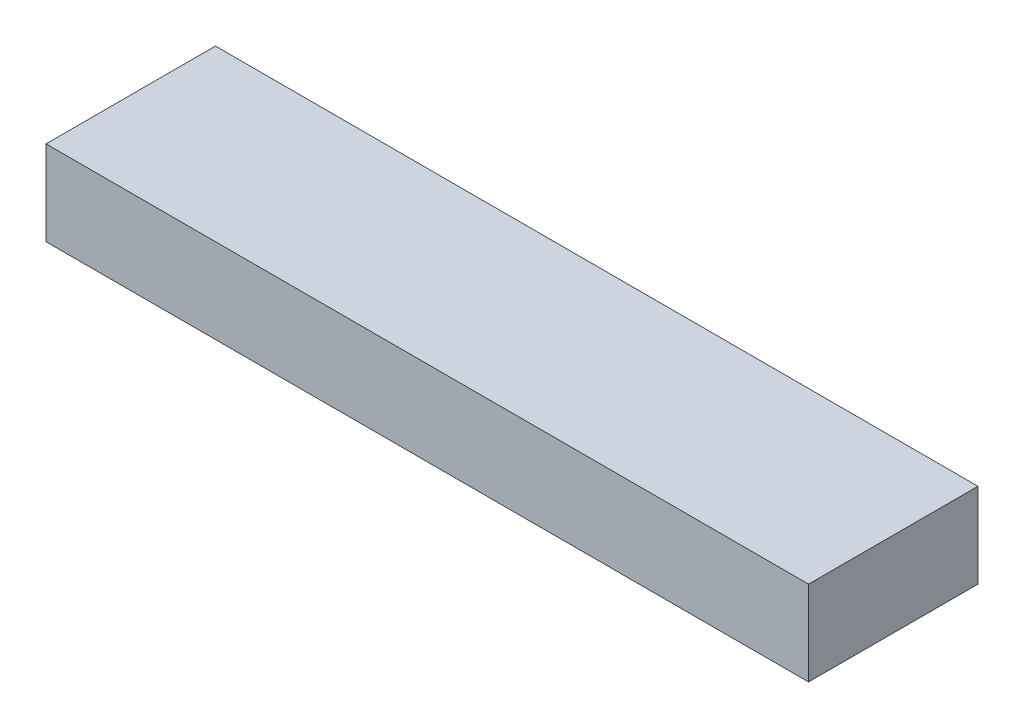
ISO-10303-21;
HEADER;
FILE_DESCRIPTION(('STEP AP214'),'2;1');
FILE_NAME('part.step','',(''),(''),'','','');
FILE_SCHEMA(('AUTOMOTIVE_DESIGN { 1 0 10303 214 1 1 1 1 }'));
ENDSEC;
DATA;
#1=APPLICATION_CONTEXT('core data for automotive mechanical design processes');
#2=APPLICATION_PROTOCOL_DEFINITION('international standard','automotive_design',2000,#1);
#3=PRODUCT_CONTEXT('',#1,'mechanical');
#4=PRODUCT('Part','Part','',(#3));
#5=PRODUCT_RELATED_PRODUCT_CATEGORY('part','',(#4));
#6=PRODUCT_DEFINITION_FORMATION('','',#4);
#7=PRODUCT_DEFINITION_CONTEXT('part definition',#1,'design');
#8=PRODUCT_DEFINITION('design','',#6,#7);
#9=PRODUCT_DEFINITION_SHAPE('','',#8);
#10=(LENGTH_UNIT() NAMED_UNIT(*) SI_UNIT(.MILLI.,.METRE.));
#11=(NAMED_UNIT(*) PLANE_ANGLE_UNIT() SI_UNIT($,.RADIAN.));
#12=(NAMED_UNIT(*) SI_UNIT($,.STERADIAN.) SOLID_ANGLE_UNIT());
#13=UNCERTAINTY_MEASURE_WITH_UNIT(LENGTH_MEASURE(1.E-05),#10,'distance_accuracy_value','');
#14=(GEOMETRIC_REPRESENTATION_CONTEXT(3) GLOBAL_UNCERTAINTY_ASSIGNED_CONTEXT((#13)) GLOBAL_UNIT_ASSIGNED_CONTEXT((#10,
#11,#12)) REPRESENTATION_CONTEXT('',''));
#15=CARTESIAN_POINT('',(0.,0.,0.));
#16=DIRECTION('',(0.,0.,1.));
#17=DIRECTION('',(1.,0.,0.));
#18=AXIS2_PLACEMENT_3D('',#15,#16,#17);
#19=CARTESIAN_POINT('',(225.,50.,50.));
#20=DIRECTION('',(-1.,0.,0.));
#21=DIRECTION('',(0.,0.,1.));
#22=AXIS2_PLACEMENT_3D('',#19,#20,#21);
#23=PLANE('',#22);
#24=DIRECTION('',(0.,0.,-1.));
#25=VECTOR('',#24,1.);
#26=CARTESIAN_POINT('',(225.,0.,50.));
#27=LINE('',#26,#25);
#28=CARTESIAN_POINT('',(225.,0.,50.));
#29=VERTEX_POINT('',#28);
#30=CARTESIAN_POINT('',(225.,0.,-50.));
#31=VERTEX_POINT('',#30);
#32=EDGE_CURVE('E107',#29,#31,#27,.T.);
#33=ORIENTED_EDGE('',*,*,#32,.T.);
#34=DIRECTION('',(0.,-1.,0.));
#35=VECTOR('',#34,1.);
#36=CARTESIAN_POINT('',(225.,50.,-50.));
#37=LINE('',#36,#35);
#38=CARTESIAN_POINT('',(225.,50.,-50.));
#39=VERTEX_POINT('',#38);
#40=EDGE_CURVE('E11',#39,#31,#37,.T.);
#41=ORIENTED_EDGE('',*,*,#40,.F.);
#42=DIRECTION('',(0.,0.,-1.));
#43=VECTOR('',#42,1.);
#44=CARTESIAN_POINT('',(225.,50.,50.));
#45=LINE('',#44,#43);
#46=CARTESIAN_POINT('',(225.,50.,50.));
#47=VERTEX_POINT('',#46);
#48=EDGE_CURVE('E91',#47,#39,#45,.T.);
#49=ORIENTED_EDGE('',*,*,#48,.F.);
#50=DIRECTION('',(0.,-1.,0.));
#51=VECTOR('',#50,1.);
#52=CARTESIAN_POINT('',(225.,50.,50.));
#53=LINE('',#52,#51);
#54=EDGE_CURVE('E103',#47,#29,#53,.T.);
#55=ORIENTED_EDGE('',*,*,#54,.T.);
#56=EDGE_LOOP('',(#33,#41,#49,#55));
#57=FACE_BOUND('',#56,.T.);
#58=ADVANCED_FACE('F39',(#57),#23,.F.);
#59=CARTESIAN_POINT('',(-225.,50.,-50.));
#60=DIRECTION('',(0.,0.,1.));
#61=DIRECTION('',(1.,0.,0.));
#62=AXIS2_PLACEMENT_3D('',#59,#60,#61);
#63=PLANE('',#62);
#64=DIRECTION('',(-1.,0.,0.));
#65=VECTOR('',#64,1.);
#66=CARTESIAN_POINT('',(-225.,0.,-50.));
#67=LINE('',#66,#65);
#68=CARTESIAN_POINT('',(-225.,0.,-50.));
#69=VERTEX_POINT('',#68);
#70=EDGE_CURVE('E96',#31,#69,#67,.T.);
#71=ORIENTED_EDGE('',*,*,#70,.T.);
#72=DIRECTION('',(0.,-1.,0.));
#73=VECTOR('',#72,1.);
#74=CARTESIAN_POINT('',(-225.,50.,-50.));
#75=LINE('',#74,#73);
#76=CARTESIAN_POINT('',(-225.,50.,-50.));
#77=VERTEX_POINT('',#76);
#78=EDGE_CURVE('E48',#77,#69,#75,.T.);
#79=ORIENTED_EDGE('',*,*,#78,.F.);
#80=DIRECTION('',(-1.,0.,0.));
#81=VECTOR('',#80,1.);
#82=CARTESIAN_POINT('',(-225.,50.,-50.));
#83=LINE('',#82,#81);
#84=EDGE_CURVE('E86',#39,#77,#83,.T.);
#85=ORIENTED_EDGE('',*,*,#84,.F.);
#86=ORIENTED_EDGE('',*,*,#40,.T.);
#87=EDGE_LOOP('',(#71,#79,#85,#86));
#88=FACE_BOUND('',#87,.T.);
#89=ADVANCED_FACE('F95',(#88),#63,.F.);
#90=CARTESIAN_POINT('',(-225.,50.,50.));
#91=DIRECTION('',(1.,0.,0.));
#92=DIRECTION('',(0.,0.,-1.));
#93=AXIS2_PLACEMENT_3D('',#90,#91,#92);
#94=PLANE('',#93);
#95=DIRECTION('',(0.,0.,1.));
#96=VECTOR('',#95,1.);
#97=CARTESIAN_POINT('',(-225.,0.,50.));
#98=LINE('',#97,#96);
#99=CARTESIAN_POINT('',(-225.,0.,50.));
#100=VERTEX_POINT('',#99);
#101=EDGE_CURVE('E73',#69,#100,#98,.T.);
#102=ORIENTED_EDGE('',*,*,#101,.T.);
#103=DIRECTION('',(0.,-1.,0.));
#104=VECTOR('',#103,1.);
#105=CARTESIAN_POINT('',(-225.,50.,50.));
#106=LINE('',#105,#104);
#107=CARTESIAN_POINT('',(-225.,50.,50.));
#108=VERTEX_POINT('',#107);
#109=EDGE_CURVE('E98',#108,#100,#106,.T.);
#110=ORIENTED_EDGE('',*,*,#109,.F.);
#111=DIRECTION('',(0.,0.,1.));
#112=VECTOR('',#111,1.);
#113=CARTESIAN_POINT('',(-225.,50.,50.));
#114=LINE('',#113,#112);
#115=EDGE_CURVE('E89',#77,#108,#114,.T.);
#116=ORIENTED_EDGE('',*,*,#115,.F.);
#117=ORIENTED_EDGE('',*,*,#78,.T.);
#118=EDGE_LOOP('',(#102,#110,#116,#117));
#119=FACE_BOUND('',#118,.T.);
#120=ADVANCED_FACE('F99',(#119),#94,.F.);
#121=CARTESIAN_POINT('',(-225.,50.,50.));
#122=DIRECTION('',(0.,0.,-1.));
#123=DIRECTION('',(-1.,0.,0.));
#124=AXIS2_PLACEMENT_3D('',#121,#122,#123);
#125=PLANE('',#124);
#126=DIRECTION('',(1.,0.,0.));
#127=VECTOR('',#126,1.);
#128=CARTESIAN_POINT('',(-225.,0.,50.));
#129=LINE('',#128,#127);
#130=EDGE_CURVE('E79',#100,#29,#129,.T.);
#131=ORIENTED_EDGE('',*,*,#130,.T.);
#132=ORIENTED_EDGE('',*,*,#54,.F.);
#133=DIRECTION('',(1.,0.,0.));
#134=VECTOR('',#133,1.);
#135=CARTESIAN_POINT('',(-225.,50.,50.));
#136=LINE('',#135,#134);
#137=EDGE_CURVE('E56',#108,#47,#136,.T.);
#138=ORIENTED_EDGE('',*,*,#137,.F.);
#139=ORIENTED_EDGE('',*,*,#109,.T.);
#140=EDGE_LOOP('',(#131,#132,#138,#139));
#141=FACE_BOUND('',#140,.T.);
#142=ADVANCED_FACE('F120',(#141),#125,.F.);
#143=CARTESIAN_POINT('',(0.,50.,0.));
#144=DIRECTION('',(0.,-1.,0.));
#145=DIRECTION('',(0.,0.,-1.));
#146=AXIS2_PLACEMENT_3D('',#143,#144,#145);
#147=PLANE('',#146);
#148=ORIENTED_EDGE('',*,*,#48,.T.);
#149=ORIENTED_EDGE('',*,*,#84,.T.);
#150=ORIENTED_EDGE('',*,*,#115,.T.);
#151=ORIENTED_EDGE('',*,*,#137,.T.);
#152=EDGE_LOOP('',(#148,#149,#150,#151));
#153=FACE_BOUND('',#152,.T.);
#154=ADVANCED_FACE('F87',(#153),#147,.F.);
#155=CARTESIAN_POINT('',(0.,0.,0.));
#156=DIRECTION('',(0.,-1.,0.));
#157=DIRECTION('',(0.,0.,-1.));
#158=AXIS2_PLACEMENT_3D('',#155,#156,#157);
#159=PLANE('',#158);
#160=ORIENTED_EDGE('',*,*,#32,.F.);
#161=ORIENTED_EDGE('',*,*,#130,.F.);
#162=ORIENTED_EDGE('',*,*,#101,.F.);
#163=ORIENTED_EDGE('',*,*,#70,.F.);
#164=EDGE_LOOP('',(#160,#161,#162,#163));
#165=FACE_BOUND('',#164,.T.);
#166=ADVANCED_FACE('F123',(#165),#159,.T.);
#167=CLOSED_SHELL('',(#58,#89,#120,#142,#154,#166));
#168=MANIFOLD_SOLID_BREP('B2',#167);
#169=ADVANCED_BREP_SHAPE_REPRESENTATION('',(#18,#168),#14);
#170=SHAPE_DEFINITION_REPRESENTATION(#9,#169);
ENDSEC;
END-ISO-10303-21;
